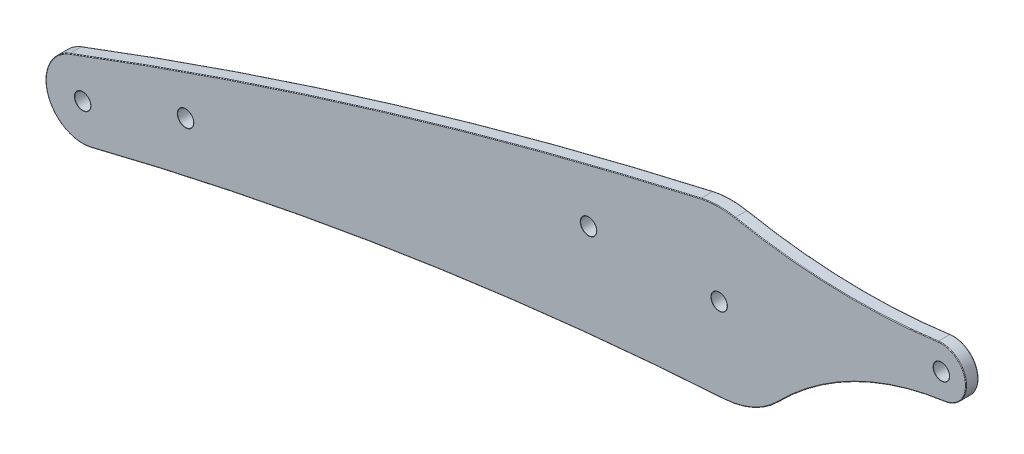
ISO-10303-21;
HEADER;
FILE_DESCRIPTION(('STEP AP214'),'2;1');
FILE_NAME('part.step','',(''),(''),'','','');
FILE_SCHEMA(('AUTOMOTIVE_DESIGN { 1 0 10303 214 1 1 1 1 }'));
ENDSEC;
DATA;
#1=APPLICATION_CONTEXT('core data for automotive mechanical design processes');
#2=APPLICATION_PROTOCOL_DEFINITION('international standard','automotive_design',2000,#1);
#3=PRODUCT_CONTEXT('',#1,'mechanical');
#4=PRODUCT('Part','Part','',(#3));
#5=PRODUCT_RELATED_PRODUCT_CATEGORY('part','',(#4));
#6=PRODUCT_DEFINITION_FORMATION('','',#4);
#7=PRODUCT_DEFINITION_CONTEXT('part definition',#1,'design');
#8=PRODUCT_DEFINITION('design','',#6,#7);
#9=PRODUCT_DEFINITION_SHAPE('','',#8);
#10=(LENGTH_UNIT() NAMED_UNIT(*) SI_UNIT(.MILLI.,.METRE.));
#11=(NAMED_UNIT(*) PLANE_ANGLE_UNIT() SI_UNIT($,.RADIAN.));
#12=(NAMED_UNIT(*) SI_UNIT($,.STERADIAN.) SOLID_ANGLE_UNIT());
#13=UNCERTAINTY_MEASURE_WITH_UNIT(LENGTH_MEASURE(1.E-05),#10,'distance_accuracy_value','');
#14=(GEOMETRIC_REPRESENTATION_CONTEXT(3) GLOBAL_UNCERTAINTY_ASSIGNED_CONTEXT((#13)) GLOBAL_UNIT_ASSIGNED_CONTEXT((#10,
#11,#12)) REPRESENTATION_CONTEXT('',''));
#15=CARTESIAN_POINT('',(0.,0.,0.));
#16=DIRECTION('',(0.,0.,1.));
#17=DIRECTION('',(1.,0.,0.));
#18=AXIS2_PLACEMENT_3D('',#15,#16,#17);
#19=CARTESIAN_POINT('',(-220.824105329464,163.117917745585,-3.));
#20=DIRECTION('',(0.,0.,1.));
#21=DIRECTION('',(1.,0.,0.));
#22=AXIS2_PLACEMENT_3D('',#19,#20,#21);
#23=CYLINDRICAL_SURFACE('',#22,8.99999999999998);
#24=DIRECTION('',(0.,0.,1.));
#25=VECTOR('',#24,1.);
#26=CARTESIAN_POINT('',(-224.015272003005,171.533169094278,-3.));
#27=LINE('',#26,#25);
#28=CARTESIAN_POINT('',(-224.015272003005,171.533169094278,-2.85));
#29=VERTEX_POINT('',#28);
#30=CARTESIAN_POINT('',(-224.015272003005,171.533169094278,-0.15));
#31=VERTEX_POINT('',#30);
#32=EDGE_CURVE('E165',#29,#31,#27,.T.);
#33=ORIENTED_EDGE('',*,*,#32,.F.);
#34=CARTESIAN_POINT('',(-220.824105329464,163.117917745585,-2.85));
#35=DIRECTION('',(0.,0.,1.));
#36=DIRECTION('',(1.,0.,0.));
#37=AXIS2_PLACEMENT_3D('',#34,#35,#36);
#38=CIRCLE('',#37,8.99999999999998);
#39=CARTESIAN_POINT('',(-218.632111132424,154.388933758881,-2.85));
#40=VERTEX_POINT('',#39);
#41=EDGE_CURVE('E160',#29,#40,#38,.T.);
#42=ORIENTED_EDGE('',*,*,#41,.T.);
#43=DIRECTION('',(0.,0.,1.));
#44=VECTOR('',#43,1.);
#45=CARTESIAN_POINT('',(-218.632111132424,154.388933758881,-3.));
#46=LINE('',#45,#44);
#47=CARTESIAN_POINT('',(-218.632111132424,154.388933758881,-0.15));
#48=VERTEX_POINT('',#47);
#49=EDGE_CURVE('E162',#40,#48,#46,.T.);
#50=ORIENTED_EDGE('',*,*,#49,.T.);
#51=CARTESIAN_POINT('',(-220.824105329464,163.117917745585,-0.15));
#52=DIRECTION('',(0.,0.,1.));
#53=DIRECTION('',(1.,0.,0.));
#54=AXIS2_PLACEMENT_3D('',#51,#52,#53);
#55=CIRCLE('',#54,8.99999999999998);
#56=EDGE_CURVE('E172',#48,#31,#55,.F.);
#57=ORIENTED_EDGE('',*,*,#56,.T.);
#58=EDGE_LOOP('',(#33,#42,#50,#57));
#59=FACE_BOUND('',#58,.T.);
#60=ADVANCED_FACE('F45',(#59),#23,.T.);
#61=CARTESIAN_POINT('',(183.744914060529,-903.74894768319,-3.));
#62=DIRECTION('',(0.,0.,1.));
#63=DIRECTION('',(1.,0.,0.));
#64=AXIS2_PLACEMENT_3D('',#61,#62,#63);
#65=CYLINDRICAL_SURFACE('',#64,1150.);
#66=DIRECTION('',(0.,0.,1.));
#67=VECTOR('',#66,1.);
#68=CARTESIAN_POINT('',(-70.5690940624645,217.778753834886,-3.));
#69=LINE('',#68,#67);
#70=CARTESIAN_POINT('',(-70.5690940624645,217.778753834886,-2.85));
#71=VERTEX_POINT('',#70);
#72=CARTESIAN_POINT('',(-70.5690940624645,217.778753834886,-0.15));
#73=VERTEX_POINT('',#72);
#74=EDGE_CURVE('E437',#71,#73,#69,.T.);
#75=ORIENTED_EDGE('',*,*,#74,.F.);
#76=CARTESIAN_POINT('',(183.744914060529,-903.74894768319,-2.85));
#77=DIRECTION('',(0.,0.,1.));
#78=DIRECTION('',(1.,0.,0.));
#79=AXIS2_PLACEMENT_3D('',#76,#77,#78);
#80=CIRCLE('',#79,1150.);
#81=EDGE_CURVE('E283',#71,#29,#80,.T.);
#82=ORIENTED_EDGE('',*,*,#81,.T.);
#83=ORIENTED_EDGE('',*,*,#32,.T.);
#84=CARTESIAN_POINT('',(183.744914060529,-903.74894768319,-0.15));
#85=DIRECTION('',(0.,0.,1.));
#86=DIRECTION('',(1.,0.,0.));
#87=AXIS2_PLACEMENT_3D('',#84,#85,#86);
#88=CIRCLE('',#87,1150.);
#89=EDGE_CURVE('E279',#31,#73,#88,.F.);
#90=ORIENTED_EDGE('',*,*,#89,.T.);
#91=EDGE_LOOP('',(#75,#82,#83,#90));
#92=FACE_BOUND('',#91,.T.);
#93=ADVANCED_FACE('F474',(#92),#65,.T.);
#94=CARTESIAN_POINT('',(-66.1462417472821,198.273924243267,-3.));
#95=DIRECTION('',(0.,0.,1.));
#96=DIRECTION('',(1.,0.,0.));
#97=AXIS2_PLACEMENT_3D('',#94,#95,#96);
#98=CYLINDRICAL_SURFACE('',#97,20.);
#99=DIRECTION('',(0.,0.,1.));
#100=VECTOR('',#99,1.);
#101=CARTESIAN_POINT('',(-62.2946168468413,217.899544886353,-3.));
#102=LINE('',#101,#100);
#103=CARTESIAN_POINT('',(-62.2946168468413,217.899544886353,-2.85));
#104=VERTEX_POINT('',#103);
#105=CARTESIAN_POINT('',(-62.2946168468413,217.899544886353,-0.15));
#106=VERTEX_POINT('',#105);
#107=EDGE_CURVE('E433',#104,#106,#102,.T.);
#108=ORIENTED_EDGE('',*,*,#107,.F.);
#109=CARTESIAN_POINT('',(-66.1462417472821,198.273924243267,-2.85));
#110=DIRECTION('',(0.,0.,1.));
#111=DIRECTION('',(1.,0.,0.));
#112=AXIS2_PLACEMENT_3D('',#109,#110,#111);
#113=CIRCLE('',#112,20.);
#114=EDGE_CURVE('E276',#104,#71,#113,.T.);
#115=ORIENTED_EDGE('',*,*,#114,.T.);
#116=ORIENTED_EDGE('',*,*,#74,.T.);
#117=CARTESIAN_POINT('',(-66.1462417472821,198.273924243267,-0.15));
#118=DIRECTION('',(0.,0.,1.));
#119=DIRECTION('',(1.,0.,0.));
#120=AXIS2_PLACEMENT_3D('',#117,#118,#119);
#121=CIRCLE('',#120,20.);
#122=EDGE_CURVE('E273',#73,#106,#121,.F.);
#123=ORIENTED_EDGE('',*,*,#122,.T.);
#124=EDGE_LOOP('',(#108,#115,#116,#123));
#125=FACE_BOUND('',#124,.T.);
#126=ADVANCED_FACE('F479',(#125),#98,.T.);
#127=CARTESIAN_POINT('',(-33.4074300935352,365.091699709494,-3.));
#128=DIRECTION('',(0.,0.,1.));
#129=DIRECTION('',(1.,0.,0.));
#130=AXIS2_PLACEMENT_3D('',#127,#128,#129);
#131=CYLINDRICAL_SURFACE('',#130,150.);
#132=DIRECTION('',(0.,0.,1.));
#133=VECTOR('',#132,1.);
#134=CARTESIAN_POINT('',(-12.9639797605995,216.491345273562,-3.));
#135=LINE('',#134,#133);
#136=CARTESIAN_POINT('',(-12.9639797605995,216.491345273562,-2.85));
#137=VERTEX_POINT('',#136);
#138=CARTESIAN_POINT('',(-12.9639797605995,216.491345273562,-0.15));
#139=VERTEX_POINT('',#138);
#140=EDGE_CURVE('E426',#137,#139,#135,.T.);
#141=ORIENTED_EDGE('',*,*,#140,.F.);
#142=CARTESIAN_POINT('',(-33.4074300935352,365.091699709494,-2.85));
#143=DIRECTION('',(0.,0.,1.));
#144=DIRECTION('',(1.,0.,0.));
#145=AXIS2_PLACEMENT_3D('',#142,#143,#144);
#146=CIRCLE('',#145,150.);
#147=EDGE_CURVE('E270',#137,#104,#146,.F.);
#148=ORIENTED_EDGE('',*,*,#147,.T.);
#149=ORIENTED_EDGE('',*,*,#107,.T.);
#150=CARTESIAN_POINT('',(-33.4074300935352,365.091699709494,-0.15));
#151=DIRECTION('',(0.,0.,1.));
#152=DIRECTION('',(1.,0.,0.));
#153=AXIS2_PLACEMENT_3D('',#150,#151,#152);
#154=CIRCLE('',#153,150.);
#155=EDGE_CURVE('E267',#106,#139,#154,.T.);
#156=ORIENTED_EDGE('',*,*,#155,.T.);
#157=EDGE_LOOP('',(#141,#148,#149,#156));
#158=FACE_BOUND('',#157,.T.);
#159=ADVANCED_FACE('F605',(#158),#131,.F.);
#160=CARTESIAN_POINT('',(-12.1462417472821,210.547331096124,-3.));
#161=DIRECTION('',(0.,0.,1.));
#162=DIRECTION('',(1.,0.,0.));
#163=AXIS2_PLACEMENT_3D('',#160,#161,#162);
#164=CYLINDRICAL_SURFACE('',#163,6.00000000000005);
#165=DIRECTION('',(0.,0.,1.));
#166=VECTOR('',#165,1.);
#167=CARTESIAN_POINT('',(-11.3378277268686,204.602041635417,-3.));
#168=LINE('',#167,#166);
#169=CARTESIAN_POINT('',(-11.3378277268686,204.602041635417,-2.85));
#170=VERTEX_POINT('',#169);
#171=CARTESIAN_POINT('',(-11.3378277268686,204.602041635417,-0.15));
#172=VERTEX_POINT('',#171);
#173=EDGE_CURVE('E419',#170,#172,#168,.T.);
#174=ORIENTED_EDGE('',*,*,#173,.F.);
#175=CARTESIAN_POINT('',(-12.1462417472821,210.547331096124,-2.85));
#176=DIRECTION('',(0.,0.,1.));
#177=DIRECTION('',(1.,0.,0.));
#178=AXIS2_PLACEMENT_3D('',#175,#176,#177);
#179=CIRCLE('',#178,6.00000000000005);
#180=EDGE_CURVE('E264',#170,#137,#179,.T.);
#181=ORIENTED_EDGE('',*,*,#180,.T.);
#182=ORIENTED_EDGE('',*,*,#140,.T.);
#183=CARTESIAN_POINT('',(-12.1462417472821,210.547331096124,-0.15));
#184=DIRECTION('',(0.,0.,1.));
#185=DIRECTION('',(1.,0.,0.));
#186=AXIS2_PLACEMENT_3D('',#183,#184,#185);
#187=CIRCLE('',#186,6.00000000000005);
#188=EDGE_CURVE('E261',#139,#172,#187,.F.);
#189=ORIENTED_EDGE('',*,*,#188,.T.);
#190=EDGE_LOOP('',(#174,#181,#182,#189));
#191=FACE_BOUND('',#190,.T.);
#192=ADVANCED_FACE('F609',(#191),#164,.T.);
#193=CARTESIAN_POINT('',(-1.90633082204483,135.240331260497,-3.));
#194=DIRECTION('',(0.,0.,1.));
#195=DIRECTION('',(1.,0.,0.));
#196=AXIS2_PLACEMENT_3D('',#193,#194,#195);
#197=CYLINDRICAL_SURFACE('',#196,70.);
#198=DIRECTION('',(0.,0.,1.));
#199=VECTOR('',#198,1.);
#200=CARTESIAN_POINT('',(-51.8707059861182,184.266459135985,-3.));
#201=LINE('',#200,#199);
#202=CARTESIAN_POINT('',(-51.8707059861182,184.266459135985,-2.85));
#203=VERTEX_POINT('',#202);
#204=CARTESIAN_POINT('',(-51.8707059861182,184.266459135985,-0.15));
#205=VERTEX_POINT('',#204);
#206=EDGE_CURVE('E416',#203,#205,#201,.T.);
#207=ORIENTED_EDGE('',*,*,#206,.F.);
#208=CARTESIAN_POINT('',(-1.90633082204483,135.240331260497,-2.85));
#209=DIRECTION('',(0.,0.,1.));
#210=DIRECTION('',(1.,0.,0.));
#211=AXIS2_PLACEMENT_3D('',#208,#209,#210);
#212=CIRCLE('',#211,70.);
#213=EDGE_CURVE('E258',#203,#170,#212,.F.);
#214=ORIENTED_EDGE('',*,*,#213,.T.);
#215=ORIENTED_EDGE('',*,*,#173,.T.);
#216=CARTESIAN_POINT('',(-1.90633082204483,135.240331260497,-0.15));
#217=DIRECTION('',(0.,0.,1.));
#218=DIRECTION('',(1.,0.,0.));
#219=AXIS2_PLACEMENT_3D('',#216,#217,#218);
#220=CIRCLE('',#219,70.);
#221=EDGE_CURVE('E255',#172,#205,#220,.T.);
#222=ORIENTED_EDGE('',*,*,#221,.T.);
#223=EDGE_LOOP('',(#207,#214,#215,#222));
#224=FACE_BOUND('',#223,.T.);
#225=ADVANCED_FACE('F415',(#224),#197,.F.);
#226=CARTESIAN_POINT('',(-66.1462417472821,198.273924243267,-3.));
#227=DIRECTION('',(0.,0.,1.));
#228=DIRECTION('',(1.,0.,0.));
#229=AXIS2_PLACEMENT_3D('',#226,#227,#228);
#230=CYLINDRICAL_SURFACE('',#229,20.0000000000001);
#231=DIRECTION('',(0.,0.,1.));
#232=VECTOR('',#231,1.);
#233=CARTESIAN_POINT('',(-64.8925450856778,178.313256802505,-3.));
#234=LINE('',#233,#232);
#235=CARTESIAN_POINT('',(-64.8925450856778,178.313256802505,-2.85));
#236=VERTEX_POINT('',#235);
#237=CARTESIAN_POINT('',(-64.8925450856778,178.313256802505,-0.15));
#238=VERTEX_POINT('',#237);
#239=EDGE_CURVE('E184',#236,#238,#234,.T.);
#240=ORIENTED_EDGE('',*,*,#239,.F.);
#241=CARTESIAN_POINT('',(-66.1462417472821,198.273924243267,-2.85));
#242=DIRECTION('',(0.,0.,1.));
#243=DIRECTION('',(1.,0.,0.));
#244=AXIS2_PLACEMENT_3D('',#241,#242,#243);
#245=CIRCLE('',#244,20.0000000000001);
#246=EDGE_CURVE('E252',#236,#203,#245,.T.);
#247=ORIENTED_EDGE('',*,*,#246,.T.);
#248=ORIENTED_EDGE('',*,*,#206,.T.);
#249=CARTESIAN_POINT('',(-66.1462417472821,198.273924243267,-0.15));
#250=DIRECTION('',(0.,0.,1.));
#251=DIRECTION('',(1.,0.,0.));
#252=AXIS2_PLACEMENT_3D('',#249,#250,#251);
#253=CIRCLE('',#252,20.0000000000001);
#254=EDGE_CURVE('E249',#205,#238,#253,.F.);
#255=ORIENTED_EDGE('',*,*,#254,.T.);
#256=EDGE_LOOP('',(#240,#247,#248,#255));
#257=FACE_BOUND('',#256,.T.);
#258=ADVANCED_FACE('F421',(#257),#230,.T.);
#259=CARTESIAN_POINT('',(-11.6104369674969,-670.015109429865,-3.));
#260=DIRECTION('',(0.,0.,1.));
#261=DIRECTION('',(1.,0.,0.));
#262=AXIS2_PLACEMENT_3D('',#259,#260,#261);
#263=CYLINDRICAL_SURFACE('',#262,850.);
#264=ORIENTED_EDGE('',*,*,#49,.F.);
#265=CARTESIAN_POINT('',(-11.6104369674969,-670.015109429865,-2.85));
#266=DIRECTION('',(0.,0.,1.));
#267=DIRECTION('',(1.,0.,0.));
#268=AXIS2_PLACEMENT_3D('',#265,#266,#267);
#269=CIRCLE('',#268,850.);
#270=EDGE_CURVE('E179',#40,#236,#269,.F.);
#271=ORIENTED_EDGE('',*,*,#270,.T.);
#272=ORIENTED_EDGE('',*,*,#239,.T.);
#273=CARTESIAN_POINT('',(-11.6104369674969,-670.015109429865,-0.15));
#274=DIRECTION('',(0.,0.,1.));
#275=DIRECTION('',(1.,0.,0.));
#276=AXIS2_PLACEMENT_3D('',#273,#274,#275);
#277=CIRCLE('',#276,850.);
#278=EDGE_CURVE('E182',#238,#48,#277,.T.);
#279=ORIENTED_EDGE('',*,*,#278,.T.);
#280=EDGE_LOOP('',(#264,#271,#272,#279));
#281=FACE_BOUND('',#280,.T.);
#282=ADVANCED_FACE('F176',(#281),#263,.F.);
#283=CARTESIAN_POINT('',(-116.21727114848,-253.44859584214,-3.));
#284=DIRECTION('',(0.,0.,1.));
#285=DIRECTION('',(1.,0.,0.));
#286=AXIS2_PLACEMENT_3D('',#283,#284,#285);
#287=PLANE('',#286);
#288=CARTESIAN_POINT('',(-66.1462417472821,198.273924243267,-3.));
#289=DIRECTION('',(0.,0.,1.));
#290=DIRECTION('',(1.,0.,0.));
#291=AXIS2_PLACEMENT_3D('',#288,#289,#290);
#292=CIRCLE('',#291,19.8500000000001);
#293=CARTESIAN_POINT('',(-51.977772504327,184.371515124289,-3.));
#294=VERTEX_POINT('',#293);
#295=CARTESIAN_POINT('',(-64.9019478106398,178.462961808311,-3.));
#296=VERTEX_POINT('',#295);
#297=EDGE_CURVE('E243',#294,#296,#292,.F.);
#298=ORIENTED_EDGE('',*,*,#297,.T.);
#299=CARTESIAN_POINT('',(-11.6104369674969,-670.015109429865,-3.));
#300=DIRECTION('',(0.,0.,1.));
#301=DIRECTION('',(1.,0.,0.));
#302=AXIS2_PLACEMENT_3D('',#299,#300,#301);
#303=CIRCLE('',#302,850.15);
#304=CARTESIAN_POINT('',(-218.668644369041,154.534416825326,-3.));
#305=VERTEX_POINT('',#304);
#306=EDGE_CURVE('E246',#296,#305,#303,.T.);
#307=ORIENTED_EDGE('',*,*,#306,.T.);
#308=CARTESIAN_POINT('',(-220.824105329464,163.117917745585,-3.));
#309=DIRECTION('',(0.,0.,1.));
#310=DIRECTION('',(1.,0.,0.));
#311=AXIS2_PLACEMENT_3D('',#308,#309,#310);
#312=CIRCLE('',#311,8.84999999999998);
#313=CARTESIAN_POINT('',(-223.962085891779,171.392914905133,-3.));
#314=VERTEX_POINT('',#313);
#315=EDGE_CURVE('E190',#305,#314,#312,.F.);
#316=ORIENTED_EDGE('',*,*,#315,.T.);
#317=CARTESIAN_POINT('',(183.744914060529,-903.74894768319,-3.));
#318=DIRECTION('',(0.,0.,1.));
#319=DIRECTION('',(1.,0.,0.));
#320=AXIS2_PLACEMENT_3D('',#317,#318,#319);
#321=CIRCLE('',#320,1149.85);
#322=CARTESIAN_POINT('',(-70.5359226701006,217.632467612949,-3.));
#323=VERTEX_POINT('',#322);
#324=EDGE_CURVE('E228',#314,#323,#321,.F.);
#325=ORIENTED_EDGE('',*,*,#324,.T.);
#326=CARTESIAN_POINT('',(-66.1462417472821,198.273924243267,-3.));
#327=DIRECTION('',(0.,0.,1.));
#328=DIRECTION('',(1.,0.,0.));
#329=AXIS2_PLACEMENT_3D('',#326,#327,#328);
#330=CIRCLE('',#329,19.85);
#331=CARTESIAN_POINT('',(-62.3235040335946,217.75235273153,-3.));
#332=VERTEX_POINT('',#331);
#333=EDGE_CURVE('E231',#323,#332,#330,.F.);
#334=ORIENTED_EDGE('',*,*,#333,.T.);
#335=CARTESIAN_POINT('',(-33.4074300935352,365.091699709494,-3.));
#336=DIRECTION('',(0.,0.,1.));
#337=DIRECTION('',(1.,0.,0.));
#338=AXIS2_PLACEMENT_3D('',#335,#336,#337);
#339=CIRCLE('',#338,150.15);
#340=CARTESIAN_POINT('',(-12.9435363102666,216.342744919126,-3.));
#341=VERTEX_POINT('',#340);
#342=EDGE_CURVE('E234',#332,#341,#339,.T.);
#343=ORIENTED_EDGE('',*,*,#342,.T.);
#344=CARTESIAN_POINT('',(-12.1462417472821,210.547331096124,-3.));
#345=DIRECTION('',(0.,0.,1.));
#346=DIRECTION('',(1.,0.,0.));
#347=AXIS2_PLACEMENT_3D('',#344,#345,#346);
#348=CIRCLE('',#347,5.85000000000005);
#349=CARTESIAN_POINT('',(-11.3580380773789,204.750673871934,-3.));
#350=VERTEX_POINT('',#349);
#351=EDGE_CURVE('E237',#341,#350,#348,.F.);
#352=ORIENTED_EDGE('',*,*,#351,.T.);
#353=CARTESIAN_POINT('',(-1.90633082204483,135.240331260497,-3.));
#354=DIRECTION('',(0.,0.,1.));
#355=DIRECTION('',(1.,0.,0.));
#356=AXIS2_PLACEMENT_3D('',#353,#354,#355);
#357=CIRCLE('',#356,70.15);
#358=EDGE_CURVE('E240',#350,#294,#357,.T.);
#359=ORIENTED_EDGE('',*,*,#358,.T.);
#360=EDGE_LOOP('',(#298,#307,#316,#325,#334,#343,#352,#359));
#361=FACE_BOUND('',#360,.T.);
#362=CARTESIAN_POINT('',(-12.1462417472821,210.547331096124,-3.));
#363=DIRECTION('',(0.,0.,1.));
#364=DIRECTION('',(1.,0.,0.));
#365=AXIS2_PLACEMENT_3D('',#362,#363,#364);
#366=CIRCLE('',#365,2.09999999999999);
#367=CARTESIAN_POINT('',(-10.0462417472821,210.547331096124,-3.));
#368=VERTEX_POINT('',#367);
#369=EDGE_CURVE('E222',#368,#368,#366,.T.);
#370=ORIENTED_EDGE('',*,*,#369,.T.);
#371=EDGE_LOOP('',(#370));
#372=FACE_BOUND('',#371,.T.);
#373=CARTESIAN_POINT('',(-66.1462417472821,198.273924243267,-3.));
#374=DIRECTION('',(0.,0.,1.));
#375=DIRECTION('',(1.,0.,0.));
#376=AXIS2_PLACEMENT_3D('',#373,#374,#375);
#377=CIRCLE('',#376,2.09999999999999);
#378=CARTESIAN_POINT('',(-64.0462417472821,198.273924243267,-3.));
#379=VERTEX_POINT('',#378);
#380=EDGE_CURVE('E218',#379,#379,#377,.T.);
#381=ORIENTED_EDGE('',*,*,#380,.T.);
#382=EDGE_LOOP('',(#381));
#383=FACE_BOUND('',#382,.T.);
#384=CARTESIAN_POINT('',(-97.8962417472821,198.246037312447,-3.));
#385=DIRECTION('',(0.,0.,1.));
#386=DIRECTION('',(1.,0.,0.));
#387=AXIS2_PLACEMENT_3D('',#384,#385,#386);
#388=CIRCLE('',#387,2.09999999999999);
#389=CARTESIAN_POINT('',(-95.7962417472821,198.246037312447,-3.));
#390=VERTEX_POINT('',#389);
#391=EDGE_CURVE('E214',#390,#390,#388,.T.);
#392=ORIENTED_EDGE('',*,*,#391,.T.);
#393=EDGE_LOOP('',(#392));
#394=FACE_BOUND('',#393,.T.);
#395=CARTESIAN_POINT('',(-195.824105329464,172.033120756762,-3.));
#396=DIRECTION('',(0.,0.,1.));
#397=DIRECTION('',(1.,0.,0.));
#398=AXIS2_PLACEMENT_3D('',#395,#396,#397);
#399=CIRCLE('',#398,2.09999999999998);
#400=CARTESIAN_POINT('',(-193.724105329464,172.033120756762,-3.));
#401=VERTEX_POINT('',#400);
#402=EDGE_CURVE('E207',#401,#401,#399,.T.);
#403=ORIENTED_EDGE('',*,*,#402,.T.);
#404=EDGE_LOOP('',(#403));
#405=FACE_BOUND('',#404,.T.);
#406=CARTESIAN_POINT('',(-220.824105329464,163.117917745585,-3.));
#407=DIRECTION('',(0.,0.,1.));
#408=DIRECTION('',(1.,0.,0.));
#409=AXIS2_PLACEMENT_3D('',#406,#407,#408);
#410=CIRCLE('',#409,2.09999999999998);
#411=CARTESIAN_POINT('',(-218.724105329464,163.117917745585,-3.));
#412=VERTEX_POINT('',#411);
#413=EDGE_CURVE('E202',#412,#412,#410,.T.);
#414=ORIENTED_EDGE('',*,*,#413,.T.);
#415=EDGE_LOOP('',(#414));
#416=FACE_BOUND('',#415,.T.);
#417=ADVANCED_FACE('F597',(#361,#372,#383,#394,#405,#416),#287,.F.);
#418=CARTESIAN_POINT('',(-116.21727114848,-253.44859584214,0.));
#419=DIRECTION('',(0.,0.,1.));
#420=DIRECTION('',(1.,0.,0.));
#421=AXIS2_PLACEMENT_3D('',#418,#419,#420);
#422=PLANE('',#421);
#423=CARTESIAN_POINT('',(-66.1462417472821,198.273924243267,0.));
#424=DIRECTION('',(0.,0.,1.));
#425=DIRECTION('',(1.,0.,0.));
#426=AXIS2_PLACEMENT_3D('',#423,#424,#425);
#427=CIRCLE('',#426,19.85);
#428=CARTESIAN_POINT('',(-62.3235040335946,217.75235273153,0.));
#429=VERTEX_POINT('',#428);
#430=CARTESIAN_POINT('',(-70.5359226701006,217.632467612949,0.));
#431=VERTEX_POINT('',#430);
#432=EDGE_CURVE('E55',#429,#431,#427,.T.);
#433=ORIENTED_EDGE('',*,*,#432,.T.);
#434=CARTESIAN_POINT('',(183.744914060529,-903.74894768319,0.));
#435=DIRECTION('',(0.,0.,1.));
#436=DIRECTION('',(1.,0.,0.));
#437=AXIS2_PLACEMENT_3D('',#434,#435,#436);
#438=CIRCLE('',#437,1149.85);
#439=CARTESIAN_POINT('',(-223.962085891779,171.392914905133,0.));
#440=VERTEX_POINT('',#439);
#441=EDGE_CURVE('E11',#431,#440,#438,.T.);
#442=ORIENTED_EDGE('',*,*,#441,.T.);
#443=CARTESIAN_POINT('',(-220.824105329464,163.117917745585,0.));
#444=DIRECTION('',(0.,0.,1.));
#445=DIRECTION('',(1.,0.,0.));
#446=AXIS2_PLACEMENT_3D('',#443,#444,#445);
#447=CIRCLE('',#446,8.84999999999998);
#448=CARTESIAN_POINT('',(-218.668644369041,154.534416825326,0.));
#449=VERTEX_POINT('',#448);
#450=EDGE_CURVE('E327',#440,#449,#447,.T.);
#451=ORIENTED_EDGE('',*,*,#450,.T.);
#452=CARTESIAN_POINT('',(-11.6104369674969,-670.015109429865,0.));
#453=DIRECTION('',(0.,0.,1.));
#454=DIRECTION('',(1.,0.,0.));
#455=AXIS2_PLACEMENT_3D('',#452,#453,#454);
#456=CIRCLE('',#455,850.15);
#457=CARTESIAN_POINT('',(-64.9019478106398,178.462961808311,0.));
#458=VERTEX_POINT('',#457);
#459=EDGE_CURVE('E330',#449,#458,#456,.F.);
#460=ORIENTED_EDGE('',*,*,#459,.T.);
#461=CARTESIAN_POINT('',(-66.1462417472821,198.273924243267,0.));
#462=DIRECTION('',(0.,0.,1.));
#463=DIRECTION('',(1.,0.,0.));
#464=AXIS2_PLACEMENT_3D('',#461,#462,#463);
#465=CIRCLE('',#464,19.8500000000001);
#466=CARTESIAN_POINT('',(-51.9777725043269,184.371515124289,0.));
#467=VERTEX_POINT('',#466);
#468=EDGE_CURVE('E333',#458,#467,#465,.T.);
#469=ORIENTED_EDGE('',*,*,#468,.T.);
#470=CARTESIAN_POINT('',(-1.90633082204483,135.240331260497,0.));
#471=DIRECTION('',(0.,0.,1.));
#472=DIRECTION('',(1.,0.,0.));
#473=AXIS2_PLACEMENT_3D('',#470,#471,#472);
#474=CIRCLE('',#473,70.15);
#475=CARTESIAN_POINT('',(-11.3580380773789,204.750673871934,0.));
#476=VERTEX_POINT('',#475);
#477=EDGE_CURVE('E336',#467,#476,#474,.F.);
#478=ORIENTED_EDGE('',*,*,#477,.T.);
#479=CARTESIAN_POINT('',(-12.1462417472821,210.547331096124,0.));
#480=DIRECTION('',(0.,0.,1.));
#481=DIRECTION('',(1.,0.,0.));
#482=AXIS2_PLACEMENT_3D('',#479,#480,#481);
#483=CIRCLE('',#482,5.85000000000005);
#484=CARTESIAN_POINT('',(-12.9435363102665,216.342744919126,0.));
#485=VERTEX_POINT('',#484);
#486=EDGE_CURVE('E339',#476,#485,#483,.T.);
#487=ORIENTED_EDGE('',*,*,#486,.T.);
#488=CARTESIAN_POINT('',(-33.4074300935352,365.091699709494,0.));
#489=DIRECTION('',(0.,0.,1.));
#490=DIRECTION('',(1.,0.,0.));
#491=AXIS2_PLACEMENT_3D('',#488,#489,#490);
#492=CIRCLE('',#491,150.15);
#493=EDGE_CURVE('E66',#485,#429,#492,.F.);
#494=ORIENTED_EDGE('',*,*,#493,.T.);
#495=EDGE_LOOP('',(#433,#442,#451,#460,#469,#478,#487,#494));
#496=FACE_BOUND('',#495,.T.);
#497=CARTESIAN_POINT('',(-12.1462417472821,210.547331096124,0.));
#498=DIRECTION('',(0.,0.,1.));
#499=DIRECTION('',(1.,0.,0.));
#500=AXIS2_PLACEMENT_3D('',#497,#498,#499);
#501=CIRCLE('',#500,2.03291561975889);
#502=CARTESIAN_POINT('',(-10.1133261275232,210.547331096124,0.));
#503=VERTEX_POINT('',#502);
#504=EDGE_CURVE('E323',#503,#503,#501,.F.);
#505=ORIENTED_EDGE('',*,*,#504,.T.);
#506=EDGE_LOOP('',(#505));
#507=FACE_BOUND('',#506,.T.);
#508=CARTESIAN_POINT('',(-66.1462417472821,198.273924243267,0.));
#509=DIRECTION('',(0.,0.,1.));
#510=DIRECTION('',(1.,0.,0.));
#511=AXIS2_PLACEMENT_3D('',#508,#509,#510);
#512=CIRCLE('',#511,2.03291561975889);
#513=CARTESIAN_POINT('',(-64.1133261275232,198.273924243267,0.));
#514=VERTEX_POINT('',#513);
#515=EDGE_CURVE('E319',#514,#514,#512,.F.);
#516=ORIENTED_EDGE('',*,*,#515,.T.);
#517=EDGE_LOOP('',(#516));
#518=FACE_BOUND('',#517,.T.);
#519=CARTESIAN_POINT('',(-97.8962417472821,198.246037312447,0.));
#520=DIRECTION('',(0.,0.,1.));
#521=DIRECTION('',(1.,0.,0.));
#522=AXIS2_PLACEMENT_3D('',#519,#520,#521);
#523=CIRCLE('',#522,2.03291561975889);
#524=CARTESIAN_POINT('',(-95.8633261275232,198.246037312447,0.));
#525=VERTEX_POINT('',#524);
#526=EDGE_CURVE('E315',#525,#525,#523,.F.);
#527=ORIENTED_EDGE('',*,*,#526,.T.);
#528=EDGE_LOOP('',(#527));
#529=FACE_BOUND('',#528,.T.);
#530=CARTESIAN_POINT('',(-195.824105329464,172.033120756762,0.));
#531=DIRECTION('',(0.,0.,1.));
#532=DIRECTION('',(1.,0.,0.));
#533=AXIS2_PLACEMENT_3D('',#530,#531,#532);
#534=CIRCLE('',#533,2.03291561975886);
#535=CARTESIAN_POINT('',(-193.791189709705,172.033120756762,0.));
#536=VERTEX_POINT('',#535);
#537=EDGE_CURVE('E311',#536,#536,#534,.F.);
#538=ORIENTED_EDGE('',*,*,#537,.T.);
#539=EDGE_LOOP('',(#538));
#540=FACE_BOUND('',#539,.T.);
#541=CARTESIAN_POINT('',(-220.824105329464,163.117917745585,0.));
#542=DIRECTION('',(0.,0.,1.));
#543=DIRECTION('',(1.,0.,0.));
#544=AXIS2_PLACEMENT_3D('',#541,#542,#543);
#545=CIRCLE('',#544,2.03291561975886);
#546=CARTESIAN_POINT('',(-218.791189709705,163.117917745585,0.));
#547=VERTEX_POINT('',#546);
#548=EDGE_CURVE('E307',#547,#547,#545,.F.);
#549=ORIENTED_EDGE('',*,*,#548,.T.);
#550=EDGE_LOOP('',(#549));
#551=FACE_BOUND('',#550,.T.);
#552=ADVANCED_FACE('F595',(#496,#507,#518,#529,#540,#551),#422,.T.);
#553=CARTESIAN_POINT('',(-12.1462417472821,210.547331096124,0.));
#554=DIRECTION('',(0.,0.,1.));
#555=DIRECTION('',(1.,0.,0.));
#556=AXIS2_PLACEMENT_3D('',#553,#554,#555);
#557=CYLINDRICAL_SURFACE('',#556,1.94999999999999);
#558=CARTESIAN_POINT('',(-12.1462417472821,210.547331096124,-2.85));
#559=DIRECTION('',(0.,0.,1.));
#560=DIRECTION('',(1.,0.,0.));
#561=AXIS2_PLACEMENT_3D('',#558,#559,#560);
#562=CIRCLE('',#561,1.94999999999999);
#563=CARTESIAN_POINT('',(-10.1962417472821,210.547331096124,-2.85));
#564=VERTEX_POINT('',#563);
#565=EDGE_CURVE('E171',#564,#564,#562,.F.);
#566=ORIENTED_EDGE('',*,*,#565,.T.);
#567=EDGE_LOOP('',(#566));
#568=FACE_BOUND('',#567,.T.);
#569=CARTESIAN_POINT('',(-12.1462417472821,210.547331096124,-0.0250000000000111));
#570=DIRECTION('',(0.,0.,1.));
#571=DIRECTION('',(1.,0.,0.));
#572=AXIS2_PLACEMENT_3D('',#569,#570,#571);
#573=CIRCLE('',#572,1.94999999999999);
#574=CARTESIAN_POINT('',(-10.1962417472821,210.547331096124,-0.0250000000000111));
#575=VERTEX_POINT('',#574);
#576=EDGE_CURVE('E185',#575,#575,#573,.T.);
#577=ORIENTED_EDGE('',*,*,#576,.T.);
#578=EDGE_LOOP('',(#577));
#579=FACE_BOUND('',#578,.T.);
#580=ADVANCED_FACE('F588',(#568,#579),#557,.F.);
#581=CARTESIAN_POINT('',(-66.1462417472821,198.273924243267,0.));
#582=DIRECTION('',(0.,0.,1.));
#583=DIRECTION('',(1.,0.,0.));
#584=AXIS2_PLACEMENT_3D('',#581,#582,#583);
#585=CYLINDRICAL_SURFACE('',#584,1.94999999999999);
#586=CARTESIAN_POINT('',(-66.1462417472821,198.273924243267,-2.85));
#587=DIRECTION('',(0.,0.,1.));
#588=DIRECTION('',(1.,0.,0.));
#589=AXIS2_PLACEMENT_3D('',#586,#587,#588);
#590=CIRCLE('',#589,1.94999999999999);
#591=CARTESIAN_POINT('',(-64.1962417472821,198.273924243267,-2.85));
#592=VERTEX_POINT('',#591);
#593=EDGE_CURVE('E291',#592,#592,#590,.F.);
#594=ORIENTED_EDGE('',*,*,#593,.T.);
#595=EDGE_LOOP('',(#594));
#596=FACE_BOUND('',#595,.T.);
#597=CARTESIAN_POINT('',(-66.1462417472821,198.273924243267,-0.0250000000000111));
#598=DIRECTION('',(0.,0.,1.));
#599=DIRECTION('',(1.,0.,0.));
#600=AXIS2_PLACEMENT_3D('',#597,#598,#599);
#601=CIRCLE('',#600,1.94999999999999);
#602=CARTESIAN_POINT('',(-64.1962417472821,198.273924243267,-0.0250000000000111));
#603=VERTEX_POINT('',#602);
#604=EDGE_CURVE('E446',#603,#603,#601,.T.);
#605=ORIENTED_EDGE('',*,*,#604,.T.);
#606=EDGE_LOOP('',(#605));
#607=FACE_BOUND('',#606,.T.);
#608=ADVANCED_FACE('F579',(#596,#607),#585,.F.);
#609=CARTESIAN_POINT('',(-97.8962417472821,198.246037312447,0.));
#610=DIRECTION('',(0.,0.,1.));
#611=DIRECTION('',(1.,0.,0.));
#612=AXIS2_PLACEMENT_3D('',#609,#610,#611);
#613=CYLINDRICAL_SURFACE('',#612,1.94999999999999);
#614=CARTESIAN_POINT('',(-97.8962417472821,198.246037312447,-2.85));
#615=DIRECTION('',(0.,0.,1.));
#616=DIRECTION('',(1.,0.,0.));
#617=AXIS2_PLACEMENT_3D('',#614,#615,#616);
#618=CIRCLE('',#617,1.94999999999999);
#619=CARTESIAN_POINT('',(-95.9462417472821,198.246037312447,-2.85));
#620=VERTEX_POINT('',#619);
#621=EDGE_CURVE('E295',#620,#620,#618,.F.);
#622=ORIENTED_EDGE('',*,*,#621,.T.);
#623=EDGE_LOOP('',(#622));
#624=FACE_BOUND('',#623,.T.);
#625=CARTESIAN_POINT('',(-97.8962417472821,198.246037312447,-0.0250000000000111));
#626=DIRECTION('',(0.,0.,1.));
#627=DIRECTION('',(1.,0.,0.));
#628=AXIS2_PLACEMENT_3D('',#625,#626,#627);
#629=CIRCLE('',#628,1.94999999999999);
#630=CARTESIAN_POINT('',(-95.9462417472821,198.246037312447,-0.0250000000000111));
#631=VERTEX_POINT('',#630);
#632=EDGE_CURVE('E450',#631,#631,#629,.T.);
#633=ORIENTED_EDGE('',*,*,#632,.T.);
#634=EDGE_LOOP('',(#633));
#635=FACE_BOUND('',#634,.T.);
#636=ADVANCED_FACE('F576',(#624,#635),#613,.F.);
#637=CARTESIAN_POINT('',(-195.824105329464,172.033120756762,0.));
#638=DIRECTION('',(0.,0.,1.));
#639=DIRECTION('',(1.,0.,0.));
#640=AXIS2_PLACEMENT_3D('',#637,#638,#639);
#641=CYLINDRICAL_SURFACE('',#640,1.94999999999998);
#642=CARTESIAN_POINT('',(-195.824105329464,172.033120756762,-2.85));
#643=DIRECTION('',(0.,0.,1.));
#644=DIRECTION('',(1.,0.,0.));
#645=AXIS2_PLACEMENT_3D('',#642,#643,#644);
#646=CIRCLE('',#645,1.94999999999998);
#647=CARTESIAN_POINT('',(-193.874105329464,172.033120756762,-2.85));
#648=VERTEX_POINT('',#647);
#649=EDGE_CURVE('E299',#648,#648,#646,.F.);
#650=ORIENTED_EDGE('',*,*,#649,.T.);
#651=EDGE_LOOP('',(#650));
#652=FACE_BOUND('',#651,.T.);
#653=CARTESIAN_POINT('',(-195.824105329464,172.033120756762,-0.0250000000000111));
#654=DIRECTION('',(0.,0.,1.));
#655=DIRECTION('',(1.,0.,0.));
#656=AXIS2_PLACEMENT_3D('',#653,#654,#655);
#657=CIRCLE('',#656,1.94999999999998);
#658=CARTESIAN_POINT('',(-193.874105329464,172.033120756762,-0.0250000000000111));
#659=VERTEX_POINT('',#658);
#660=EDGE_CURVE('E454',#659,#659,#657,.T.);
#661=ORIENTED_EDGE('',*,*,#660,.T.);
#662=EDGE_LOOP('',(#661));
#663=FACE_BOUND('',#662,.T.);
#664=ADVANCED_FACE('F578',(#652,#663),#641,.F.);
#665=CARTESIAN_POINT('',(-220.824105329464,163.117917745585,0.));
#666=DIRECTION('',(0.,0.,1.));
#667=DIRECTION('',(1.,0.,0.));
#668=AXIS2_PLACEMENT_3D('',#665,#666,#667);
#669=CYLINDRICAL_SURFACE('',#668,1.94999999999998);
#670=CARTESIAN_POINT('',(-220.824105329464,163.117917745585,-2.85));
#671=DIRECTION('',(0.,0.,1.));
#672=DIRECTION('',(1.,0.,0.));
#673=AXIS2_PLACEMENT_3D('',#670,#671,#672);
#674=CIRCLE('',#673,1.94999999999998);
#675=CARTESIAN_POINT('',(-218.874105329464,163.117917745585,-2.85));
#676=VERTEX_POINT('',#675);
#677=EDGE_CURVE('E303',#676,#676,#674,.F.);
#678=ORIENTED_EDGE('',*,*,#677,.T.);
#679=EDGE_LOOP('',(#678));
#680=FACE_BOUND('',#679,.T.);
#681=CARTESIAN_POINT('',(-220.824105329464,163.117917745585,-0.0250000000000111));
#682=DIRECTION('',(0.,0.,1.));
#683=DIRECTION('',(1.,0.,0.));
#684=AXIS2_PLACEMENT_3D('',#681,#682,#683);
#685=CIRCLE('',#684,1.94999999999998);
#686=CARTESIAN_POINT('',(-218.874105329464,163.117917745585,-0.0250000000000111));
#687=VERTEX_POINT('',#686);
#688=EDGE_CURVE('E370',#687,#687,#685,.T.);
#689=ORIENTED_EDGE('',*,*,#688,.T.);
#690=EDGE_LOOP('',(#689));
#691=FACE_BOUND('',#690,.T.);
#692=ADVANCED_FACE('F462',(#680,#691),#669,.F.);
#693=CARTESIAN_POINT('',(-33.4074300935352,365.091699709494,-2.85));
#694=DIRECTION('',(0.,0.,1.));
#695=DIRECTION('',(1.,0.,0.));
#696=AXIS2_PLACEMENT_3D('',#693,#694,#695);
#697=TOROIDAL_SURFACE('',#696,150.15,0.15);
#698=CARTESIAN_POINT('',(-12.9435363102666,216.342744919126,-2.85));
#699=DIRECTION('',(0.990669029572884,0.136289668886235,0.));
#700=DIRECTION('',(-0.136289668886235,0.990669029572885,0.));
#701=AXIS2_PLACEMENT_3D('',#698,#699,#700);
#702=CIRCLE('',#701,0.15);
#703=EDGE_CURVE('E362',#341,#137,#702,.T.);
#704=ORIENTED_EDGE('',*,*,#703,.F.);
#705=ORIENTED_EDGE('',*,*,#342,.F.);
#706=CARTESIAN_POINT('',(-62.3235040335946,217.75235273153,-2.85));
#707=DIRECTION('',(-0.981281032154277,0.192581245022033,0.));
#708=DIRECTION('',(-0.192581245022033,-0.981281032154277,0.));
#709=AXIS2_PLACEMENT_3D('',#706,#707,#708);
#710=CIRCLE('',#709,0.15);
#711=EDGE_CURVE('E366',#104,#332,#710,.T.);
#712=ORIENTED_EDGE('',*,*,#711,.F.);
#713=ORIENTED_EDGE('',*,*,#147,.F.);
#714=EDGE_LOOP('',(#704,#705,#712,#713));
#715=FACE_BOUND('',#714,.T.);
#716=ADVANCED_FACE('F509',(#715),#697,.T.);
#717=CARTESIAN_POINT('',(-66.1462417472821,198.273924243267,-2.85));
#718=DIRECTION('',(0.,0.,1.));
#719=DIRECTION('',(1.,0.,0.));
#720=AXIS2_PLACEMENT_3D('',#717,#718,#719);
#721=TOROIDAL_SURFACE('',#720,19.85,0.15);
#722=ORIENTED_EDGE('',*,*,#711,.T.);
#723=ORIENTED_EDGE('',*,*,#333,.F.);
#724=CARTESIAN_POINT('',(-70.5359226701006,217.632467612949,-2.85));
#725=DIRECTION('',(-0.975241479580942,-0.221142615759097,0.));
#726=DIRECTION('',(0.221142615759097,-0.975241479580942,0.));
#727=AXIS2_PLACEMENT_3D('',#724,#725,#726);
#728=CIRCLE('',#727,0.15);
#729=EDGE_CURVE('E358',#71,#323,#728,.T.);
#730=ORIENTED_EDGE('',*,*,#729,.F.);
#731=ORIENTED_EDGE('',*,*,#114,.F.);
#732=EDGE_LOOP('',(#722,#723,#730,#731));
#733=FACE_BOUND('',#732,.T.);
#734=ADVANCED_FACE('F505',(#733),#721,.T.);
#735=CARTESIAN_POINT('',(-12.1462417472821,210.547331096124,-2.85));
#736=DIRECTION('',(0.,0.,1.));
#737=DIRECTION('',(1.,0.,0.));
#738=AXIS2_PLACEMENT_3D('',#735,#736,#737);
#739=TOROIDAL_SURFACE('',#738,5.85000000000005,0.15);
#740=ORIENTED_EDGE('',*,*,#703,.T.);
#741=ORIENTED_EDGE('',*,*,#180,.F.);
#742=CARTESIAN_POINT('',(-11.3580380773789,204.750673871934,-2.85));
#743=DIRECTION('',(-0.990881576784573,-0.134735670068911,0.));
#744=DIRECTION('',(0.134735670068911,-0.990881576784573,0.));
#745=AXIS2_PLACEMENT_3D('',#742,#743,#744);
#746=CIRCLE('',#745,0.15);
#747=EDGE_CURVE('E354',#350,#170,#746,.T.);
#748=ORIENTED_EDGE('',*,*,#747,.F.);
#749=ORIENTED_EDGE('',*,*,#351,.F.);
#750=EDGE_LOOP('',(#740,#741,#748,#749));
#751=FACE_BOUND('',#750,.T.);
#752=ADVANCED_FACE('F501',(#751),#739,.T.);
#753=CARTESIAN_POINT('',(183.744914060529,-903.74894768319,-2.85));
#754=DIRECTION('',(0.,0.,1.));
#755=DIRECTION('',(1.,0.,0.));
#756=AXIS2_PLACEMENT_3D('',#753,#754,#755);
#757=TOROIDAL_SURFACE('',#756,1149.85,0.15);
#758=ORIENTED_EDGE('',*,*,#729,.T.);
#759=ORIENTED_EDGE('',*,*,#324,.F.);
#760=CARTESIAN_POINT('',(-223.962085891779,171.392914905133,-2.85));
#761=DIRECTION('',(-0.935027927632592,-0.354574074837825,0.));
#762=DIRECTION('',(0.354574074837825,-0.935027927632592,0.));
#763=AXIS2_PLACEMENT_3D('',#760,#761,#762);
#764=CIRCLE('',#763,0.15);
#765=EDGE_CURVE('E351',#29,#314,#764,.T.);
#766=ORIENTED_EDGE('',*,*,#765,.F.);
#767=ORIENTED_EDGE('',*,*,#81,.F.);
#768=EDGE_LOOP('',(#758,#759,#766,#767));
#769=FACE_BOUND('',#768,.T.);
#770=ADVANCED_FACE('F497',(#769),#757,.T.);
#771=CARTESIAN_POINT('',(-1.90633082204483,135.240331260497,-2.85));
#772=DIRECTION('',(0.,0.,1.));
#773=DIRECTION('',(1.,0.,0.));
#774=AXIS2_PLACEMENT_3D('',#771,#772,#773);
#775=TOROIDAL_SURFACE('',#774,70.15,0.15);
#776=ORIENTED_EDGE('',*,*,#747,.T.);
#777=ORIENTED_EDGE('',*,*,#213,.F.);
#778=CARTESIAN_POINT('',(-51.977772504327,184.371515124289,-2.85));
#779=DIRECTION('',(-0.700373255364144,-0.713776788058166,0.));
#780=DIRECTION('',(0.713776788058166,-0.700373255364144,0.));
#781=AXIS2_PLACEMENT_3D('',#778,#779,#780);
#782=CIRCLE('',#781,0.15);
#783=EDGE_CURVE('E195',#294,#203,#782,.T.);
#784=ORIENTED_EDGE('',*,*,#783,.F.);
#785=ORIENTED_EDGE('',*,*,#358,.F.);
#786=EDGE_LOOP('',(#776,#777,#784,#785));
#787=FACE_BOUND('',#786,.T.);
#788=ADVANCED_FACE('F494',(#787),#775,.T.);
#789=CARTESIAN_POINT('',(-220.824105329464,163.117917745585,-2.85));
#790=DIRECTION('',(0.,0.,1.));
#791=DIRECTION('',(1.,0.,0.));
#792=AXIS2_PLACEMENT_3D('',#789,#790,#791);
#793=TOROIDAL_SURFACE('',#792,8.84999999999998,0.15);
#794=ORIENTED_EDGE('',*,*,#765,.T.);
#795=ORIENTED_EDGE('',*,*,#315,.F.);
#796=CARTESIAN_POINT('',(-218.668644369041,154.534416825326,-2.85));
#797=DIRECTION('',(0.969887109633815,0.243554910782279,0.));
#798=DIRECTION('',(-0.243554910782279,0.969887109633815,0.));
#799=AXIS2_PLACEMENT_3D('',#796,#797,#798);
#800=CIRCLE('',#799,0.15);
#801=EDGE_CURVE('E188',#40,#305,#800,.T.);
#802=ORIENTED_EDGE('',*,*,#801,.F.);
#803=ORIENTED_EDGE('',*,*,#41,.F.);
#804=EDGE_LOOP('',(#794,#795,#802,#803));
#805=FACE_BOUND('',#804,.T.);
#806=ADVANCED_FACE('F189',(#805),#793,.T.);
#807=CARTESIAN_POINT('',(-66.1462417472821,198.273924243267,-2.85));
#808=DIRECTION('',(0.,0.,1.));
#809=DIRECTION('',(1.,0.,0.));
#810=AXIS2_PLACEMENT_3D('',#807,#808,#809);
#811=TOROIDAL_SURFACE('',#810,19.8500000000001,0.15);
#812=ORIENTED_EDGE('',*,*,#783,.T.);
#813=ORIENTED_EDGE('',*,*,#246,.F.);
#814=CARTESIAN_POINT('',(-64.9019478106398,178.462961808311,-2.85));
#815=DIRECTION('',(-0.998033372038085,-0.0626848330801752,0.));
#816=DIRECTION('',(0.0626848330801752,-0.998033372038085,0.));
#817=AXIS2_PLACEMENT_3D('',#814,#815,#816);
#818=CIRCLE('',#817,0.15);
#819=EDGE_CURVE('E196',#296,#236,#818,.T.);
#820=ORIENTED_EDGE('',*,*,#819,.F.);
#821=ORIENTED_EDGE('',*,*,#297,.F.);
#822=EDGE_LOOP('',(#812,#813,#820,#821));
#823=FACE_BOUND('',#822,.T.);
#824=ADVANCED_FACE('F488',(#823),#811,.T.);
#825=CARTESIAN_POINT('',(-11.6104369674969,-670.015109429865,-2.85));
#826=DIRECTION('',(0.,0.,1.));
#827=DIRECTION('',(1.,0.,0.));
#828=AXIS2_PLACEMENT_3D('',#825,#826,#827);
#829=TOROIDAL_SURFACE('',#828,850.15,0.15);
#830=ORIENTED_EDGE('',*,*,#801,.T.);
#831=ORIENTED_EDGE('',*,*,#306,.F.);
#832=ORIENTED_EDGE('',*,*,#819,.T.);
#833=ORIENTED_EDGE('',*,*,#270,.F.);
#834=EDGE_LOOP('',(#830,#831,#832,#833));
#835=FACE_BOUND('',#834,.T.);
#836=ADVANCED_FACE('F198',(#835),#829,.T.);
#837=CARTESIAN_POINT('',(-12.1462417472821,210.547331096124,-2.85));
#838=DIRECTION('',(0.,0.,1.));
#839=DIRECTION('',(1.,0.,0.));
#840=AXIS2_PLACEMENT_3D('',#837,#838,#839);
#841=TOROIDAL_SURFACE('',#840,2.09999999999999,0.15);
#842=ORIENTED_EDGE('',*,*,#565,.F.);
#843=EDGE_LOOP('',(#842));
#844=FACE_BOUND('',#843,.T.);
#845=ORIENTED_EDGE('',*,*,#369,.F.);
#846=EDGE_LOOP('',(#845));
#847=FACE_BOUND('',#846,.T.);
#848=ADVANCED_FACE('F487',(#844,#847),#841,.T.);
#849=CARTESIAN_POINT('',(-66.1462417472821,198.273924243267,-2.85));
#850=DIRECTION('',(0.,0.,1.));
#851=DIRECTION('',(1.,0.,0.));
#852=AXIS2_PLACEMENT_3D('',#849,#850,#851);
#853=TOROIDAL_SURFACE('',#852,2.09999999999999,0.15);
#854=ORIENTED_EDGE('',*,*,#593,.F.);
#855=EDGE_LOOP('',(#854));
#856=FACE_BOUND('',#855,.T.);
#857=ORIENTED_EDGE('',*,*,#380,.F.);
#858=EDGE_LOOP('',(#857));
#859=FACE_BOUND('',#858,.T.);
#860=ADVANCED_FACE('F516',(#856,#859),#853,.T.);
#861=CARTESIAN_POINT('',(-97.8962417472821,198.246037312447,-2.85));
#862=DIRECTION('',(0.,0.,1.));
#863=DIRECTION('',(1.,0.,0.));
#864=AXIS2_PLACEMENT_3D('',#861,#862,#863);
#865=TOROIDAL_SURFACE('',#864,2.09999999999999,0.15);
#866=ORIENTED_EDGE('',*,*,#621,.F.);
#867=EDGE_LOOP('',(#866));
#868=FACE_BOUND('',#867,.T.);
#869=ORIENTED_EDGE('',*,*,#391,.F.);
#870=EDGE_LOOP('',(#869));
#871=FACE_BOUND('',#870,.T.);
#872=ADVANCED_FACE('F520',(#868,#871),#865,.T.);
#873=CARTESIAN_POINT('',(-195.824105329464,172.033120756762,-2.85));
#874=DIRECTION('',(0.,0.,1.));
#875=DIRECTION('',(1.,0.,0.));
#876=AXIS2_PLACEMENT_3D('',#873,#874,#875);
#877=TOROIDAL_SURFACE('',#876,2.09999999999998,0.15);
#878=ORIENTED_EDGE('',*,*,#649,.F.);
#879=EDGE_LOOP('',(#878));
#880=FACE_BOUND('',#879,.T.);
#881=ORIENTED_EDGE('',*,*,#402,.F.);
#882=EDGE_LOOP('',(#881));
#883=FACE_BOUND('',#882,.T.);
#884=ADVANCED_FACE('F524',(#880,#883),#877,.T.);
#885=CARTESIAN_POINT('',(-220.824105329464,163.117917745585,-2.85));
#886=DIRECTION('',(0.,0.,1.));
#887=DIRECTION('',(1.,0.,0.));
#888=AXIS2_PLACEMENT_3D('',#885,#886,#887);
#889=TOROIDAL_SURFACE('',#888,2.09999999999998,0.15);
#890=ORIENTED_EDGE('',*,*,#677,.F.);
#891=EDGE_LOOP('',(#890));
#892=FACE_BOUND('',#891,.T.);
#893=ORIENTED_EDGE('',*,*,#413,.F.);
#894=EDGE_LOOP('',(#893));
#895=FACE_BOUND('',#894,.T.);
#896=ADVANCED_FACE('F528',(#892,#895),#889,.T.);
#897=CARTESIAN_POINT('',(-1.90633082204483,135.240331260497,-0.15));
#898=DIRECTION('',(0.,0.,1.));
#899=DIRECTION('',(1.,0.,0.));
#900=AXIS2_PLACEMENT_3D('',#897,#898,#899);
#901=TOROIDAL_SURFACE('',#900,70.15,0.15);
#902=CARTESIAN_POINT('',(-51.977772504327,184.371515124289,-0.15));
#903=DIRECTION('',(-0.700373255364144,-0.713776788058166,0.));
#904=DIRECTION('',(0.713776788058166,-0.700373255364144,0.));
#905=AXIS2_PLACEMENT_3D('',#902,#903,#904);
#906=CIRCLE('',#905,0.15);
#907=EDGE_CURVE('E392',#205,#467,#906,.T.);
#908=ORIENTED_EDGE('',*,*,#907,.F.);
#909=ORIENTED_EDGE('',*,*,#221,.F.);
#910=CARTESIAN_POINT('',(-11.3580380773789,204.750673871934,-0.15));
#911=DIRECTION('',(0.990881576784574,0.1347356700689,0.));
#912=DIRECTION('',(-0.1347356700689,0.990881576784574,0.));
#913=AXIS2_PLACEMENT_3D('',#910,#911,#912);
#914=CIRCLE('',#913,0.15);
#915=EDGE_CURVE('E49',#476,#172,#914,.T.);
#916=ORIENTED_EDGE('',*,*,#915,.F.);
#917=ORIENTED_EDGE('',*,*,#477,.F.);
#918=EDGE_LOOP('',(#908,#909,#916,#917));
#919=FACE_BOUND('',#918,.T.);
#920=ADVANCED_FACE('F410',(#919),#901,.T.);
#921=CARTESIAN_POINT('',(-12.1462417472821,210.547331096124,-0.15));
#922=DIRECTION('',(0.,0.,1.));
#923=DIRECTION('',(1.,0.,0.));
#924=AXIS2_PLACEMENT_3D('',#921,#922,#923);
#925=TOROIDAL_SURFACE('',#924,5.85000000000005,0.15);
#926=ORIENTED_EDGE('',*,*,#915,.T.);
#927=ORIENTED_EDGE('',*,*,#188,.F.);
#928=CARTESIAN_POINT('',(-12.9435363102665,216.342744919126,-0.15));
#929=DIRECTION('',(-0.990669029572881,-0.13628966888626,0.));
#930=DIRECTION('',(0.13628966888626,-0.990669029572881,0.));
#931=AXIS2_PLACEMENT_3D('',#928,#929,#930);
#932=CIRCLE('',#931,0.15);
#933=EDGE_CURVE('E389',#485,#139,#932,.T.);
#934=ORIENTED_EDGE('',*,*,#933,.F.);
#935=ORIENTED_EDGE('',*,*,#486,.F.);
#936=EDGE_LOOP('',(#926,#927,#934,#935));
#937=FACE_BOUND('',#936,.T.);
#938=ADVANCED_FACE('F405',(#937),#925,.T.);
#939=CARTESIAN_POINT('',(-66.1462417472821,198.273924243267,-0.15));
#940=DIRECTION('',(0.,0.,1.));
#941=DIRECTION('',(1.,0.,0.));
#942=AXIS2_PLACEMENT_3D('',#939,#940,#941);
#943=TOROIDAL_SURFACE('',#942,19.8500000000001,0.15);
#944=ORIENTED_EDGE('',*,*,#907,.T.);
#945=ORIENTED_EDGE('',*,*,#468,.F.);
#946=CARTESIAN_POINT('',(-64.9019478106398,178.462961808311,-0.15));
#947=DIRECTION('',(-0.998033372038085,-0.0626848330801752,0.));
#948=DIRECTION('',(0.0626848330801752,-0.998033372038085,0.));
#949=AXIS2_PLACEMENT_3D('',#946,#947,#948);
#950=CIRCLE('',#949,0.15);
#951=EDGE_CURVE('E385',#238,#458,#950,.T.);
#952=ORIENTED_EDGE('',*,*,#951,.F.);
#953=ORIENTED_EDGE('',*,*,#254,.F.);
#954=EDGE_LOOP('',(#944,#945,#952,#953));
#955=FACE_BOUND('',#954,.T.);
#956=ADVANCED_FACE('F553',(#955),#943,.T.);
#957=CARTESIAN_POINT('',(-33.4074300935352,365.091699709494,-0.15));
#958=DIRECTION('',(0.,0.,1.));
#959=DIRECTION('',(1.,0.,0.));
#960=AXIS2_PLACEMENT_3D('',#957,#958,#959);
#961=TOROIDAL_SURFACE('',#960,150.15,0.15);
#962=ORIENTED_EDGE('',*,*,#933,.T.);
#963=ORIENTED_EDGE('',*,*,#155,.F.);
#964=CARTESIAN_POINT('',(-62.3235040335946,217.75235273153,-0.15));
#965=DIRECTION('',(-0.981281032154275,0.192581245022042,0.));
#966=DIRECTION('',(-0.192581245022042,-0.981281032154276,0.));
#967=AXIS2_PLACEMENT_3D('',#964,#965,#966);
#968=CIRCLE('',#967,0.15);
#969=EDGE_CURVE('E381',#429,#106,#968,.T.);
#970=ORIENTED_EDGE('',*,*,#969,.F.);
#971=ORIENTED_EDGE('',*,*,#493,.F.);
#972=EDGE_LOOP('',(#962,#963,#970,#971));
#973=FACE_BOUND('',#972,.T.);
#974=ADVANCED_FACE('F549',(#973),#961,.T.);
#975=CARTESIAN_POINT('',(-11.6104369674969,-670.015109429865,-0.15));
#976=DIRECTION('',(0.,0.,1.));
#977=DIRECTION('',(1.,0.,0.));
#978=AXIS2_PLACEMENT_3D('',#975,#976,#977);
#979=TOROIDAL_SURFACE('',#978,850.15,0.15);
#980=ORIENTED_EDGE('',*,*,#951,.T.);
#981=ORIENTED_EDGE('',*,*,#459,.F.);
#982=CARTESIAN_POINT('',(-218.668644369041,154.534416825326,-0.15));
#983=DIRECTION('',(-0.969887109633815,-0.243554910782279,0.));
#984=DIRECTION('',(0.243554910782279,-0.969887109633815,0.));
#985=AXIS2_PLACEMENT_3D('',#982,#983,#984);
#986=CIRCLE('',#985,0.15);
#987=EDGE_CURVE('E377',#48,#449,#986,.T.);
#988=ORIENTED_EDGE('',*,*,#987,.F.);
#989=ORIENTED_EDGE('',*,*,#278,.F.);
#990=EDGE_LOOP('',(#980,#981,#988,#989));
#991=FACE_BOUND('',#990,.T.);
#992=ADVANCED_FACE('F545',(#991),#979,.T.);
#993=CARTESIAN_POINT('',(-66.1462417472821,198.273924243267,-0.15));
#994=DIRECTION('',(0.,0.,1.));
#995=DIRECTION('',(1.,0.,0.));
#996=AXIS2_PLACEMENT_3D('',#993,#994,#995);
#997=TOROIDAL_SURFACE('',#996,19.85,0.15);
#998=ORIENTED_EDGE('',*,*,#969,.T.);
#999=ORIENTED_EDGE('',*,*,#122,.F.);
#1000=CARTESIAN_POINT('',(-70.5359226701006,217.632467612949,-0.15));
#1001=DIRECTION('',(-0.975241479580951,-0.221142615759057,0.));
#1002=DIRECTION('',(0.221142615759057,-0.975241479580951,0.));
#1003=AXIS2_PLACEMENT_3D('',#1000,#1001,#1002);
#1004=CIRCLE('',#1003,0.15);
#1005=EDGE_CURVE('E374',#431,#73,#1004,.T.);
#1006=ORIENTED_EDGE('',*,*,#1005,.F.);
#1007=ORIENTED_EDGE('',*,*,#432,.F.);
#1008=EDGE_LOOP('',(#998,#999,#1006,#1007));
#1009=FACE_BOUND('',#1008,.T.);
#1010=ADVANCED_FACE('F541',(#1009),#997,.T.);
#1011=CARTESIAN_POINT('',(-220.824105329464,163.117917745585,-0.15));
#1012=DIRECTION('',(0.,0.,1.));
#1013=DIRECTION('',(1.,0.,0.));
#1014=AXIS2_PLACEMENT_3D('',#1011,#1012,#1013);
#1015=TOROIDAL_SURFACE('',#1014,8.84999999999998,0.15);
#1016=ORIENTED_EDGE('',*,*,#987,.T.);
#1017=ORIENTED_EDGE('',*,*,#450,.F.);
#1018=CARTESIAN_POINT('',(-223.962085891779,171.392914905133,-0.15));
#1019=DIRECTION('',(0.935027927632592,0.354574074837825,0.));
#1020=DIRECTION('',(-0.354574074837825,0.935027927632592,0.));
#1021=AXIS2_PLACEMENT_3D('',#1018,#1019,#1020);
#1022=CIRCLE('',#1021,0.15);
#1023=EDGE_CURVE('E371',#31,#440,#1022,.T.);
#1024=ORIENTED_EDGE('',*,*,#1023,.F.);
#1025=ORIENTED_EDGE('',*,*,#56,.F.);
#1026=EDGE_LOOP('',(#1016,#1017,#1024,#1025));
#1027=FACE_BOUND('',#1026,.T.);
#1028=ADVANCED_FACE('F537',(#1027),#1015,.T.);
#1029=CARTESIAN_POINT('',(183.744914060529,-903.74894768319,-0.15));
#1030=DIRECTION('',(0.,0.,1.));
#1031=DIRECTION('',(1.,0.,0.));
#1032=AXIS2_PLACEMENT_3D('',#1029,#1030,#1031);
#1033=TOROIDAL_SURFACE('',#1032,1149.85,0.15);
#1034=ORIENTED_EDGE('',*,*,#1005,.T.);
#1035=ORIENTED_EDGE('',*,*,#89,.F.);
#1036=ORIENTED_EDGE('',*,*,#1023,.T.);
#1037=ORIENTED_EDGE('',*,*,#441,.F.);
#1038=EDGE_LOOP('',(#1034,#1035,#1036,#1037));
#1039=FACE_BOUND('',#1038,.T.);
#1040=ADVANCED_FACE('F533',(#1039),#1033,.T.);
#1041=CARTESIAN_POINT('',(-12.1462417472821,210.547331096124,-0.15));
#1042=DIRECTION('',(0.,0.,1.));
#1043=DIRECTION('',(1.,0.,0.));
#1044=AXIS2_PLACEMENT_3D('',#1041,#1042,#1043);
#1045=TOROIDAL_SURFACE('',#1044,2.03291561975889,0.15);
#1046=ORIENTED_EDGE('',*,*,#504,.F.);
#1047=EDGE_LOOP('',(#1046));
#1048=FACE_BOUND('',#1047,.T.);
#1049=ORIENTED_EDGE('',*,*,#576,.F.);
#1050=EDGE_LOOP('',(#1049));
#1051=FACE_BOUND('',#1050,.T.);
#1052=ADVANCED_FACE('F536',(#1048,#1051),#1045,.T.);
#1053=CARTESIAN_POINT('',(-66.1462417472821,198.273924243267,-0.15));
#1054=DIRECTION('',(0.,0.,1.));
#1055=DIRECTION('',(1.,0.,0.));
#1056=AXIS2_PLACEMENT_3D('',#1053,#1054,#1055);
#1057=TOROIDAL_SURFACE('',#1056,2.03291561975889,0.15);
#1058=ORIENTED_EDGE('',*,*,#515,.F.);
#1059=EDGE_LOOP('',(#1058));
#1060=FACE_BOUND('',#1059,.T.);
#1061=ORIENTED_EDGE('',*,*,#604,.F.);
#1062=EDGE_LOOP('',(#1061));
#1063=FACE_BOUND('',#1062,.T.);
#1064=ADVANCED_FACE('F563',(#1060,#1063),#1057,.T.);
#1065=CARTESIAN_POINT('',(-97.8962417472821,198.246037312447,-0.15));
#1066=DIRECTION('',(0.,0.,1.));
#1067=DIRECTION('',(1.,0.,0.));
#1068=AXIS2_PLACEMENT_3D('',#1065,#1066,#1067);
#1069=TOROIDAL_SURFACE('',#1068,2.03291561975889,0.15);
#1070=ORIENTED_EDGE('',*,*,#526,.F.);
#1071=EDGE_LOOP('',(#1070));
#1072=FACE_BOUND('',#1071,.T.);
#1073=ORIENTED_EDGE('',*,*,#632,.F.);
#1074=EDGE_LOOP('',(#1073));
#1075=FACE_BOUND('',#1074,.T.);
#1076=ADVANCED_FACE('F470',(#1072,#1075),#1069,.T.);
#1077=CARTESIAN_POINT('',(-195.824105329464,172.033120756762,-0.15));
#1078=DIRECTION('',(0.,0.,1.));
#1079=DIRECTION('',(1.,0.,0.));
#1080=AXIS2_PLACEMENT_3D('',#1077,#1078,#1079);
#1081=TOROIDAL_SURFACE('',#1080,2.03291561975886,0.15);
#1082=ORIENTED_EDGE('',*,*,#537,.F.);
#1083=EDGE_LOOP('',(#1082));
#1084=FACE_BOUND('',#1083,.T.);
#1085=ORIENTED_EDGE('',*,*,#660,.F.);
#1086=EDGE_LOOP('',(#1085));
#1087=FACE_BOUND('',#1086,.T.);
#1088=ADVANCED_FACE('F465',(#1084,#1087),#1081,.T.);
#1089=CARTESIAN_POINT('',(-220.824105329464,163.117917745585,-0.15));
#1090=DIRECTION('',(0.,0.,1.));
#1091=DIRECTION('',(1.,0.,0.));
#1092=AXIS2_PLACEMENT_3D('',#1089,#1090,#1091);
#1093=TOROIDAL_SURFACE('',#1092,2.03291561975886,0.15);
#1094=ORIENTED_EDGE('',*,*,#548,.F.);
#1095=EDGE_LOOP('',(#1094));
#1096=FACE_BOUND('',#1095,.T.);
#1097=ORIENTED_EDGE('',*,*,#688,.F.);
#1098=EDGE_LOOP('',(#1097));
#1099=FACE_BOUND('',#1098,.T.);
#1100=ADVANCED_FACE('F47',(#1096,#1099),#1093,.T.);
#1101=CLOSED_SHELL('',(#60,#93,#126,#159,#192,#225,#258,#282,#417,#552,#580,#608,#636,#664,#692,
#716,#734,#752,#770,#788,#806,#824,#836,#848,#860,#872,#884,#896,#920,#938,#956,#974,#992,#1010,
#1028,#1040,#1052,#1064,#1076,#1088,#1100));
#1102=MANIFOLD_SOLID_BREP('B2',#1101);
#1103=ADVANCED_BREP_SHAPE_REPRESENTATION('',(#18,#1102),#14);
#1104=SHAPE_DEFINITION_REPRESENTATION(#9,#1103);
ENDSEC;
END-ISO-10303-21;
